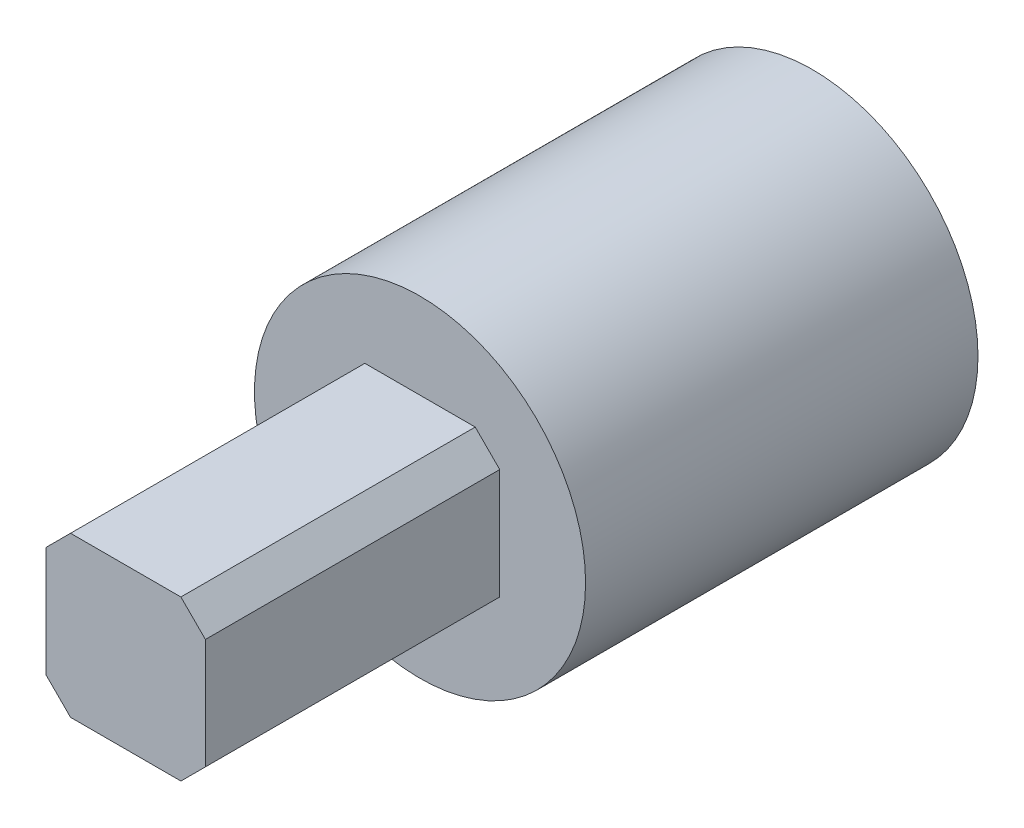
ISO-10303-21;
HEADER;
FILE_DESCRIPTION(('STEP AP214'),'2;1');
FILE_NAME('part.step','',(''),(''),'','','');
FILE_SCHEMA(('AUTOMOTIVE_DESIGN { 1 0 10303 214 1 1 1 1 }'));
ENDSEC;
DATA;
#1=APPLICATION_CONTEXT('core data for automotive mechanical design processes');
#2=APPLICATION_PROTOCOL_DEFINITION('international standard','automotive_design',2000,#1);
#3=PRODUCT_CONTEXT('',#1,'mechanical');
#4=PRODUCT('Part','Part','',(#3));
#5=PRODUCT_RELATED_PRODUCT_CATEGORY('part','',(#4));
#6=PRODUCT_DEFINITION_FORMATION('','',#4);
#7=PRODUCT_DEFINITION_CONTEXT('part definition',#1,'design');
#8=PRODUCT_DEFINITION('design','',#6,#7);
#9=PRODUCT_DEFINITION_SHAPE('','',#8);
#10=(LENGTH_UNIT() NAMED_UNIT(*) SI_UNIT(.MILLI.,.METRE.));
#11=(NAMED_UNIT(*) PLANE_ANGLE_UNIT() SI_UNIT($,.RADIAN.));
#12=(NAMED_UNIT(*) SI_UNIT($,.STERADIAN.) SOLID_ANGLE_UNIT());
#13=UNCERTAINTY_MEASURE_WITH_UNIT(LENGTH_MEASURE(1.E-05),#10,'distance_accuracy_value','');
#14=(GEOMETRIC_REPRESENTATION_CONTEXT(3) GLOBAL_UNCERTAINTY_ASSIGNED_CONTEXT((#13)) GLOBAL_UNIT_ASSIGNED_CONTEXT((#10,
#11,#12)) REPRESENTATION_CONTEXT('',''));
#15=CARTESIAN_POINT('',(0.,0.,0.));
#16=DIRECTION('',(0.,0.,1.));
#17=DIRECTION('',(1.,0.,0.));
#18=AXIS2_PLACEMENT_3D('',#15,#16,#17);
#19=CARTESIAN_POINT('',(0.,0.,32.));
#20=DIRECTION('',(0.,0.,-1.));
#21=DIRECTION('',(-1.,0.,0.));
#22=AXIS2_PLACEMENT_3D('',#19,#20,#21);
#23=CYLINDRICAL_SURFACE('',#22,13.5);
#24=CARTESIAN_POINT('',(0.,0.,32.));
#25=DIRECTION('',(0.,0.,1.));
#26=DIRECTION('',(1.,0.,0.));
#27=AXIS2_PLACEMENT_3D('',#24,#25,#26);
#28=CIRCLE('',#27,13.5);
#29=CARTESIAN_POINT('',(13.5,0.,32.));
#30=VERTEX_POINT('',#29);
#31=EDGE_CURVE('E11',#30,#30,#28,.T.);
#32=ORIENTED_EDGE('',*,*,#31,.F.);
#33=EDGE_LOOP('',(#32));
#34=FACE_BOUND('',#33,.T.);
#35=CARTESIAN_POINT('',(0.,0.,0.));
#36=DIRECTION('',(0.,0.,1.));
#37=DIRECTION('',(1.,0.,0.));
#38=AXIS2_PLACEMENT_3D('',#35,#36,#37);
#39=CIRCLE('',#38,13.5);
#40=CARTESIAN_POINT('',(13.5,0.,0.));
#41=VERTEX_POINT('',#40);
#42=EDGE_CURVE('E42',#41,#41,#39,.T.);
#43=ORIENTED_EDGE('',*,*,#42,.T.);
#44=EDGE_LOOP('',(#43));
#45=FACE_BOUND('',#44,.T.);
#46=ADVANCED_FACE('F39',(#34,#45),#23,.T.);
#47=CARTESIAN_POINT('',(0.,0.,32.));
#48=DIRECTION('',(0.,0.,1.));
#49=DIRECTION('',(1.,0.,0.));
#50=AXIS2_PLACEMENT_3D('',#47,#48,#49);
#51=PLANE('',#50);
#52=DIRECTION('',(0.,-1.,0.));
#53=VECTOR('',#52,1.);
#54=CARTESIAN_POINT('',(-6.5,-4.5,32.));
#55=LINE('',#54,#53);
#56=CARTESIAN_POINT('',(-6.5,4.5,32.));
#57=VERTEX_POINT('',#56);
#58=CARTESIAN_POINT('',(-6.5,-4.5,32.));
#59=VERTEX_POINT('',#58);
#60=EDGE_CURVE('E54',#57,#59,#55,.T.);
#61=ORIENTED_EDGE('',*,*,#60,.F.);
#62=DIRECTION('',(-0.707106781186547,-0.707106781186548,0.));
#63=VECTOR('',#62,1.);
#64=CARTESIAN_POINT('',(-6.5,4.5,32.));
#65=LINE('',#64,#63);
#66=CARTESIAN_POINT('',(-4.5,6.5,32.));
#67=VERTEX_POINT('',#66);
#68=EDGE_CURVE('E58',#67,#57,#65,.T.);
#69=ORIENTED_EDGE('',*,*,#68,.F.);
#70=DIRECTION('',(-1.,0.,0.));
#71=VECTOR('',#70,1.);
#72=CARTESIAN_POINT('',(-4.5,6.5,32.));
#73=LINE('',#72,#71);
#74=CARTESIAN_POINT('',(4.5,6.5,32.));
#75=VERTEX_POINT('',#74);
#76=EDGE_CURVE('E158',#75,#67,#73,.T.);
#77=ORIENTED_EDGE('',*,*,#76,.F.);
#78=DIRECTION('',(-0.707106781186548,0.707106781186548,0.));
#79=VECTOR('',#78,1.);
#80=CARTESIAN_POINT('',(4.5,6.5,32.));
#81=LINE('',#80,#79);
#82=CARTESIAN_POINT('',(6.5,4.5,32.));
#83=VERTEX_POINT('',#82);
#84=EDGE_CURVE('E161',#83,#75,#81,.T.);
#85=ORIENTED_EDGE('',*,*,#84,.F.);
#86=DIRECTION('',(0.,1.,0.));
#87=VECTOR('',#86,1.);
#88=CARTESIAN_POINT('',(6.5,-4.5,32.));
#89=LINE('',#88,#87);
#90=CARTESIAN_POINT('',(6.5,-4.5,32.));
#91=VERTEX_POINT('',#90);
#92=EDGE_CURVE('E165',#91,#83,#89,.T.);
#93=ORIENTED_EDGE('',*,*,#92,.F.);
#94=DIRECTION('',(0.707106781186547,0.707106781186548,0.));
#95=VECTOR('',#94,1.);
#96=CARTESIAN_POINT('',(4.5,-6.5,32.));
#97=LINE('',#96,#95);
#98=CARTESIAN_POINT('',(4.5,-6.5,32.));
#99=VERTEX_POINT('',#98);
#100=EDGE_CURVE('E169',#99,#91,#97,.T.);
#101=ORIENTED_EDGE('',*,*,#100,.F.);
#102=DIRECTION('',(1.,0.,0.));
#103=VECTOR('',#102,1.);
#104=CARTESIAN_POINT('',(-4.5,-6.5,32.));
#105=LINE('',#104,#103);
#106=CARTESIAN_POINT('',(-4.5,-6.5,32.));
#107=VERTEX_POINT('',#106);
#108=EDGE_CURVE('E173',#107,#99,#105,.T.);
#109=ORIENTED_EDGE('',*,*,#108,.F.);
#110=DIRECTION('',(0.707106781186548,-0.707106781186548,0.));
#111=VECTOR('',#110,1.);
#112=CARTESIAN_POINT('',(-6.5,-4.5,32.));
#113=LINE('',#112,#111);
#114=EDGE_CURVE('E177',#59,#107,#113,.T.);
#115=ORIENTED_EDGE('',*,*,#114,.F.);
#116=EDGE_LOOP('',(#61,#69,#77,#85,#93,#101,#109,#115));
#117=FACE_BOUND('',#116,.T.);
#118=ORIENTED_EDGE('',*,*,#31,.T.);
#119=EDGE_LOOP('',(#118));
#120=FACE_BOUND('',#119,.T.);
#121=ADVANCED_FACE('F227',(#117,#120),#51,.T.);
#122=CARTESIAN_POINT('',(0.,0.,0.));
#123=DIRECTION('',(0.,0.,1.));
#124=DIRECTION('',(1.,0.,0.));
#125=AXIS2_PLACEMENT_3D('',#122,#123,#124);
#126=PLANE('',#125);
#127=ORIENTED_EDGE('',*,*,#42,.F.);
#128=EDGE_LOOP('',(#127));
#129=FACE_BOUND('',#128,.T.);
#130=ADVANCED_FACE('F232',(#129),#126,.F.);
#131=CARTESIAN_POINT('',(-6.5,-4.5,56.));
#132=DIRECTION('',(1.,0.,0.));
#133=DIRECTION('',(0.,0.,-1.));
#134=AXIS2_PLACEMENT_3D('',#131,#132,#133);
#135=PLANE('',#134);
#136=ORIENTED_EDGE('',*,*,#60,.T.);
#137=DIRECTION('',(0.,0.,-1.));
#138=VECTOR('',#137,1.);
#139=CARTESIAN_POINT('',(-6.5,-4.5,56.));
#140=LINE('',#139,#138);
#141=CARTESIAN_POINT('',(-6.5,-4.5,56.));
#142=VERTEX_POINT('',#141);
#143=EDGE_CURVE('E107',#142,#59,#140,.T.);
#144=ORIENTED_EDGE('',*,*,#143,.F.);
#145=DIRECTION('',(0.,-1.,0.));
#146=VECTOR('',#145,1.);
#147=CARTESIAN_POINT('',(-6.5,-4.5,56.));
#148=LINE('',#147,#146);
#149=CARTESIAN_POINT('',(-6.5,4.5,56.));
#150=VERTEX_POINT('',#149);
#151=EDGE_CURVE('E114',#150,#142,#148,.T.);
#152=ORIENTED_EDGE('',*,*,#151,.F.);
#153=DIRECTION('',(0.,0.,-1.));
#154=VECTOR('',#153,1.);
#155=CARTESIAN_POINT('',(-6.5,4.5,56.));
#156=LINE('',#155,#154);
#157=EDGE_CURVE('E153',#150,#57,#156,.T.);
#158=ORIENTED_EDGE('',*,*,#157,.T.);
#159=EDGE_LOOP('',(#136,#144,#152,#158));
#160=FACE_BOUND('',#159,.T.);
#161=ADVANCED_FACE('F125',(#160),#135,.F.);
#162=CARTESIAN_POINT('',(-6.5,-4.5,56.));
#163=DIRECTION('',(0.707106781186547,0.707106781186547,0.));
#164=DIRECTION('',(-0.707106781186548,0.707106781186548,0.));
#165=AXIS2_PLACEMENT_3D('',#162,#163,#164);
#166=PLANE('',#165);
#167=ORIENTED_EDGE('',*,*,#114,.T.);
#168=DIRECTION('',(0.,0.,-1.));
#169=VECTOR('',#168,1.);
#170=CARTESIAN_POINT('',(-4.5,-6.5,56.));
#171=LINE('',#170,#169);
#172=CARTESIAN_POINT('',(-4.5,-6.5,56.));
#173=VERTEX_POINT('',#172);
#174=EDGE_CURVE('E109',#173,#107,#171,.T.);
#175=ORIENTED_EDGE('',*,*,#174,.F.);
#176=DIRECTION('',(0.707106781186548,-0.707106781186548,0.));
#177=VECTOR('',#176,1.);
#178=CARTESIAN_POINT('',(-6.5,-4.5,56.));
#179=LINE('',#178,#177);
#180=EDGE_CURVE('E102',#142,#173,#179,.T.);
#181=ORIENTED_EDGE('',*,*,#180,.F.);
#182=ORIENTED_EDGE('',*,*,#143,.T.);
#183=EDGE_LOOP('',(#167,#175,#181,#182));
#184=FACE_BOUND('',#183,.T.);
#185=ADVANCED_FACE('F105',(#184),#166,.F.);
#186=CARTESIAN_POINT('',(-4.5,-6.5,56.));
#187=DIRECTION('',(0.,1.,0.));
#188=DIRECTION('',(0.,0.,1.));
#189=AXIS2_PLACEMENT_3D('',#186,#187,#188);
#190=PLANE('',#189);
#191=ORIENTED_EDGE('',*,*,#108,.T.);
#192=DIRECTION('',(0.,0.,-1.));
#193=VECTOR('',#192,1.);
#194=CARTESIAN_POINT('',(4.5,-6.5,56.));
#195=LINE('',#194,#193);
#196=CARTESIAN_POINT('',(4.5,-6.5,56.));
#197=VERTEX_POINT('',#196);
#198=EDGE_CURVE('E131',#197,#99,#195,.T.);
#199=ORIENTED_EDGE('',*,*,#198,.F.);
#200=DIRECTION('',(1.,0.,0.));
#201=VECTOR('',#200,1.);
#202=CARTESIAN_POINT('',(-4.5,-6.5,56.));
#203=LINE('',#202,#201);
#204=EDGE_CURVE('E113',#173,#197,#203,.T.);
#205=ORIENTED_EDGE('',*,*,#204,.F.);
#206=ORIENTED_EDGE('',*,*,#174,.T.);
#207=EDGE_LOOP('',(#191,#199,#205,#206));
#208=FACE_BOUND('',#207,.T.);
#209=ADVANCED_FACE('F201',(#208),#190,.F.);
#210=CARTESIAN_POINT('',(4.5,-6.5,56.));
#211=DIRECTION('',(-0.707106781186548,0.707106781186547,0.));
#212=DIRECTION('',(-0.707106781186547,-0.707106781186548,0.));
#213=AXIS2_PLACEMENT_3D('',#210,#211,#212);
#214=PLANE('',#213);
#215=ORIENTED_EDGE('',*,*,#100,.T.);
#216=DIRECTION('',(0.,0.,-1.));
#217=VECTOR('',#216,1.);
#218=CARTESIAN_POINT('',(6.5,-4.5,56.));
#219=LINE('',#218,#217);
#220=CARTESIAN_POINT('',(6.5,-4.5,56.));
#221=VERTEX_POINT('',#220);
#222=EDGE_CURVE('E137',#221,#91,#219,.T.);
#223=ORIENTED_EDGE('',*,*,#222,.F.);
#224=DIRECTION('',(0.707106781186547,0.707106781186548,0.));
#225=VECTOR('',#224,1.);
#226=CARTESIAN_POINT('',(4.5,-6.5,56.));
#227=LINE('',#226,#225);
#228=EDGE_CURVE('E193',#197,#221,#227,.T.);
#229=ORIENTED_EDGE('',*,*,#228,.F.);
#230=ORIENTED_EDGE('',*,*,#198,.T.);
#231=EDGE_LOOP('',(#215,#223,#229,#230));
#232=FACE_BOUND('',#231,.T.);
#233=ADVANCED_FACE('F203',(#232),#214,.F.);
#234=CARTESIAN_POINT('',(6.5,-4.5,56.));
#235=DIRECTION('',(-1.,0.,0.));
#236=DIRECTION('',(0.,0.,1.));
#237=AXIS2_PLACEMENT_3D('',#234,#235,#236);
#238=PLANE('',#237);
#239=ORIENTED_EDGE('',*,*,#92,.T.);
#240=DIRECTION('',(0.,0.,-1.));
#241=VECTOR('',#240,1.);
#242=CARTESIAN_POINT('',(6.5,4.5,56.));
#243=LINE('',#242,#241);
#244=CARTESIAN_POINT('',(6.5,4.5,56.));
#245=VERTEX_POINT('',#244);
#246=EDGE_CURVE('E141',#245,#83,#243,.T.);
#247=ORIENTED_EDGE('',*,*,#246,.F.);
#248=DIRECTION('',(0.,1.,0.));
#249=VECTOR('',#248,1.);
#250=CARTESIAN_POINT('',(6.5,-4.5,56.));
#251=LINE('',#250,#249);
#252=EDGE_CURVE('E190',#221,#245,#251,.T.);
#253=ORIENTED_EDGE('',*,*,#252,.F.);
#254=ORIENTED_EDGE('',*,*,#222,.T.);
#255=EDGE_LOOP('',(#239,#247,#253,#254));
#256=FACE_BOUND('',#255,.T.);
#257=ADVANCED_FACE('F207',(#256),#238,.F.);
#258=CARTESIAN_POINT('',(4.5,6.5,56.));
#259=DIRECTION('',(-0.707106781186547,-0.707106781186547,0.));
#260=DIRECTION('',(0.707106781186548,-0.707106781186548,0.));
#261=AXIS2_PLACEMENT_3D('',#258,#259,#260);
#262=PLANE('',#261);
#263=ORIENTED_EDGE('',*,*,#84,.T.);
#264=DIRECTION('',(0.,0.,-1.));
#265=VECTOR('',#264,1.);
#266=CARTESIAN_POINT('',(4.5,6.5,56.));
#267=LINE('',#266,#265);
#268=CARTESIAN_POINT('',(4.5,6.5,56.));
#269=VERTEX_POINT('',#268);
#270=EDGE_CURVE('E145',#269,#75,#267,.T.);
#271=ORIENTED_EDGE('',*,*,#270,.F.);
#272=DIRECTION('',(-0.707106781186548,0.707106781186548,0.));
#273=VECTOR('',#272,1.);
#274=CARTESIAN_POINT('',(4.5,6.5,56.));
#275=LINE('',#274,#273);
#276=EDGE_CURVE('E187',#245,#269,#275,.T.);
#277=ORIENTED_EDGE('',*,*,#276,.F.);
#278=ORIENTED_EDGE('',*,*,#246,.T.);
#279=EDGE_LOOP('',(#263,#271,#277,#278));
#280=FACE_BOUND('',#279,.T.);
#281=ADVANCED_FACE('F213',(#280),#262,.F.);
#282=CARTESIAN_POINT('',(-4.5,6.5,56.));
#283=DIRECTION('',(0.,-1.,0.));
#284=DIRECTION('',(0.,0.,-1.));
#285=AXIS2_PLACEMENT_3D('',#282,#283,#284);
#286=PLANE('',#285);
#287=ORIENTED_EDGE('',*,*,#76,.T.);
#288=DIRECTION('',(0.,0.,-1.));
#289=VECTOR('',#288,1.);
#290=CARTESIAN_POINT('',(-4.5,6.5,56.));
#291=LINE('',#290,#289);
#292=CARTESIAN_POINT('',(-4.5,6.5,56.));
#293=VERTEX_POINT('',#292);
#294=EDGE_CURVE('E149',#293,#67,#291,.T.);
#295=ORIENTED_EDGE('',*,*,#294,.F.);
#296=DIRECTION('',(-1.,0.,0.));
#297=VECTOR('',#296,1.);
#298=CARTESIAN_POINT('',(-4.5,6.5,56.));
#299=LINE('',#298,#297);
#300=EDGE_CURVE('E184',#269,#293,#299,.T.);
#301=ORIENTED_EDGE('',*,*,#300,.F.);
#302=ORIENTED_EDGE('',*,*,#270,.T.);
#303=EDGE_LOOP('',(#287,#295,#301,#302));
#304=FACE_BOUND('',#303,.T.);
#305=ADVANCED_FACE('F215',(#304),#286,.F.);
#306=CARTESIAN_POINT('',(-6.5,4.5,56.));
#307=DIRECTION('',(0.707106781186548,-0.707106781186547,0.));
#308=DIRECTION('',(0.707106781186547,0.707106781186548,0.));
#309=AXIS2_PLACEMENT_3D('',#306,#307,#308);
#310=PLANE('',#309);
#311=ORIENTED_EDGE('',*,*,#68,.T.);
#312=ORIENTED_EDGE('',*,*,#157,.F.);
#313=DIRECTION('',(-0.707106781186547,-0.707106781186548,0.));
#314=VECTOR('',#313,1.);
#315=CARTESIAN_POINT('',(-6.5,4.5,56.));
#316=LINE('',#315,#314);
#317=EDGE_CURVE('E119',#293,#150,#316,.T.);
#318=ORIENTED_EDGE('',*,*,#317,.F.);
#319=ORIENTED_EDGE('',*,*,#294,.T.);
#320=EDGE_LOOP('',(#311,#312,#318,#319));
#321=FACE_BOUND('',#320,.T.);
#322=ADVANCED_FACE('F217',(#321),#310,.F.);
#323=CARTESIAN_POINT('',(0.,0.,56.));
#324=DIRECTION('',(0.,0.,-1.));
#325=DIRECTION('',(-1.,0.,0.));
#326=AXIS2_PLACEMENT_3D('',#323,#324,#325);
#327=PLANE('',#326);
#328=ORIENTED_EDGE('',*,*,#151,.T.);
#329=ORIENTED_EDGE('',*,*,#180,.T.);
#330=ORIENTED_EDGE('',*,*,#204,.T.);
#331=ORIENTED_EDGE('',*,*,#228,.T.);
#332=ORIENTED_EDGE('',*,*,#252,.T.);
#333=ORIENTED_EDGE('',*,*,#276,.T.);
#334=ORIENTED_EDGE('',*,*,#300,.T.);
#335=ORIENTED_EDGE('',*,*,#317,.T.);
#336=EDGE_LOOP('',(#328,#329,#330,#331,#332,#333,#334,#335));
#337=FACE_BOUND('',#336,.T.);
#338=ADVANCED_FACE('F117',(#337),#327,.F.);
#339=CLOSED_SHELL('',(#46,#121,#130,#161,#185,#209,#233,#257,#281,#305,#322,#338));
#340=MANIFOLD_SOLID_BREP('B2',#339);
#341=ADVANCED_BREP_SHAPE_REPRESENTATION('',(#18,#340),#14);
#342=SHAPE_DEFINITION_REPRESENTATION(#9,#341);
ENDSEC;
END-ISO-10303-21;
